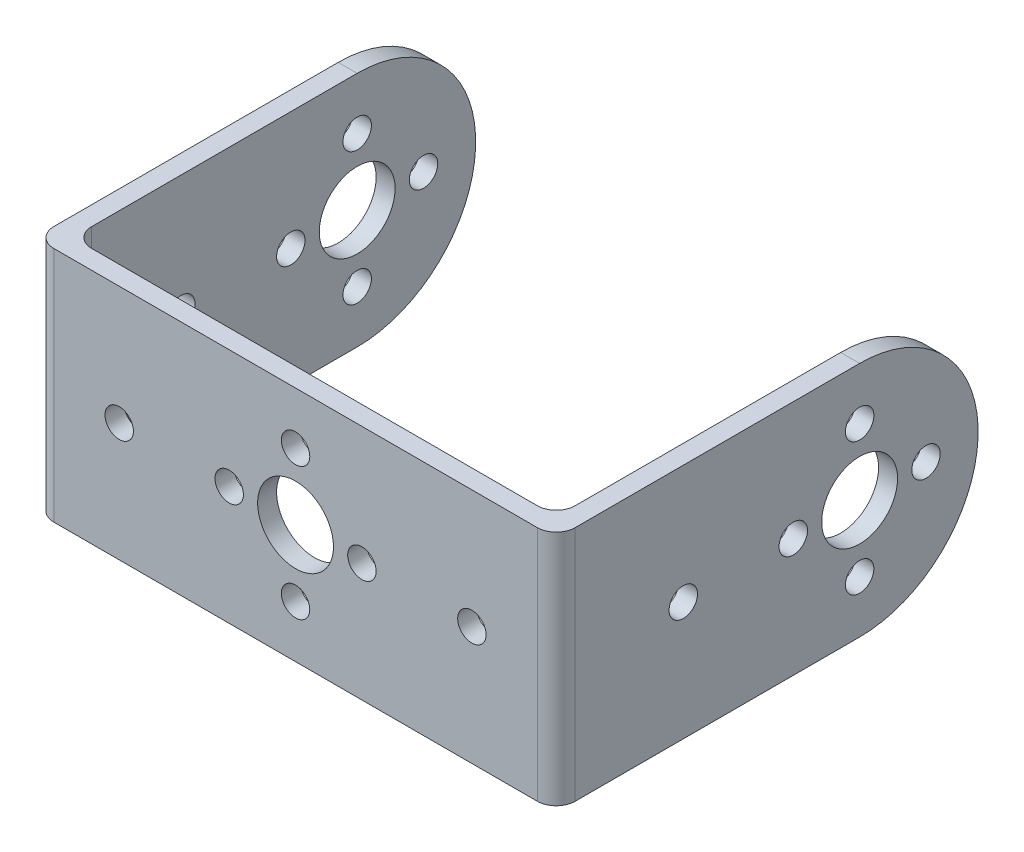
ISO-10303-21;
HEADER;
FILE_DESCRIPTION(('STEP AP214'),'2;1');
FILE_NAME('part.step','',(''),(''),'','','');
FILE_SCHEMA(('AUTOMOTIVE_DESIGN { 1 0 10303 214 1 1 1 1 }'));
ENDSEC;
DATA;
#1=APPLICATION_CONTEXT('core data for automotive mechanical design processes');
#2=APPLICATION_PROTOCOL_DEFINITION('international standard','automotive_design',2000,#1);
#3=PRODUCT_CONTEXT('',#1,'mechanical');
#4=PRODUCT('Part','Part','',(#3));
#5=PRODUCT_RELATED_PRODUCT_CATEGORY('part','',(#4));
#6=PRODUCT_DEFINITION_FORMATION('','',#4);
#7=PRODUCT_DEFINITION_CONTEXT('part definition',#1,'design');
#8=PRODUCT_DEFINITION('design','',#6,#7);
#9=PRODUCT_DEFINITION_SHAPE('','',#8);
#10=(LENGTH_UNIT() NAMED_UNIT(*) SI_UNIT(.MILLI.,.METRE.));
#11=(NAMED_UNIT(*) PLANE_ANGLE_UNIT() SI_UNIT($,.RADIAN.));
#12=(NAMED_UNIT(*) SI_UNIT($,.STERADIAN.) SOLID_ANGLE_UNIT());
#13=UNCERTAINTY_MEASURE_WITH_UNIT(LENGTH_MEASURE(1.E-05),#10,'distance_accuracy_value','');
#14=(GEOMETRIC_REPRESENTATION_CONTEXT(3) GLOBAL_UNCERTAINTY_ASSIGNED_CONTEXT((#13)) GLOBAL_UNIT_ASSIGNED_CONTEXT((#10,
#11,#12)) REPRESENTATION_CONTEXT('',''));
#15=CARTESIAN_POINT('',(0.,0.,0.));
#16=DIRECTION('',(0.,0.,1.));
#17=DIRECTION('',(1.,0.,0.));
#18=AXIS2_PLACEMENT_3D('',#15,#16,#17);
#19=CARTESIAN_POINT('',(-25.5,25.,-44.5));
#20=DIRECTION('',(1.,0.,0.));
#21=DIRECTION('',(0.,0.,-1.));
#22=AXIS2_PLACEMENT_3D('',#19,#20,#21);
#23=PLANE('',#22);
#24=CARTESIAN_POINT('',(-25.5,12.5,-32.));
#25=DIRECTION('',(1.,0.,0.));
#26=DIRECTION('',(0.,0.,-1.));
#27=AXIS2_PLACEMENT_3D('',#24,#25,#26);
#28=CIRCLE('',#27,4.00000000000001);
#29=CARTESIAN_POINT('',(-25.5,12.5,-36.));
#30=VERTEX_POINT('',#29);
#31=EDGE_CURVE('E324',#30,#30,#28,.F.);
#32=ORIENTED_EDGE('',*,*,#31,.T.);
#33=EDGE_LOOP('',(#32));
#34=FACE_BOUND('',#33,.T.);
#35=CARTESIAN_POINT('',(-25.5,19.5,-32.));
#36=DIRECTION('',(1.,0.,0.));
#37=DIRECTION('',(0.,0.,-1.));
#38=AXIS2_PLACEMENT_3D('',#35,#36,#37);
#39=CIRCLE('',#38,1.5);
#40=CARTESIAN_POINT('',(-25.5,19.5,-33.5));
#41=VERTEX_POINT('',#40);
#42=EDGE_CURVE('E321',#41,#41,#39,.F.);
#43=ORIENTED_EDGE('',*,*,#42,.T.);
#44=EDGE_LOOP('',(#43));
#45=FACE_BOUND('',#44,.T.);
#46=CARTESIAN_POINT('',(-25.5,12.5,-39.));
#47=DIRECTION('',(1.,0.,0.));
#48=DIRECTION('',(0.,0.,-1.));
#49=AXIS2_PLACEMENT_3D('',#46,#47,#48);
#50=CIRCLE('',#49,1.5);
#51=CARTESIAN_POINT('',(-25.5,12.5,-40.5));
#52=VERTEX_POINT('',#51);
#53=EDGE_CURVE('E318',#52,#52,#50,.F.);
#54=ORIENTED_EDGE('',*,*,#53,.T.);
#55=EDGE_LOOP('',(#54));
#56=FACE_BOUND('',#55,.T.);
#57=CARTESIAN_POINT('',(-25.5,5.5,-32.));
#58=DIRECTION('',(1.,0.,0.));
#59=DIRECTION('',(0.,0.,-1.));
#60=AXIS2_PLACEMENT_3D('',#57,#58,#59);
#61=CIRCLE('',#60,1.5);
#62=CARTESIAN_POINT('',(-25.5,5.5,-33.5));
#63=VERTEX_POINT('',#62);
#64=EDGE_CURVE('E301',#63,#63,#61,.F.);
#65=ORIENTED_EDGE('',*,*,#64,.T.);
#66=EDGE_LOOP('',(#65));
#67=FACE_BOUND('',#66,.T.);
#68=CARTESIAN_POINT('',(-25.5,12.5,-13.4));
#69=DIRECTION('',(1.,0.,0.));
#70=DIRECTION('',(0.,0.,-1.));
#71=AXIS2_PLACEMENT_3D('',#68,#69,#70);
#72=CIRCLE('',#71,1.5);
#73=CARTESIAN_POINT('',(-25.5,12.5,-14.9));
#74=VERTEX_POINT('',#73);
#75=EDGE_CURVE('E329',#74,#74,#72,.F.);
#76=ORIENTED_EDGE('',*,*,#75,.T.);
#77=EDGE_LOOP('',(#76));
#78=FACE_BOUND('',#77,.T.);
#79=CARTESIAN_POINT('',(-25.5,12.5,-25.));
#80=DIRECTION('',(1.,0.,0.));
#81=DIRECTION('',(0.,0.,-1.));
#82=AXIS2_PLACEMENT_3D('',#79,#80,#81);
#83=CIRCLE('',#82,1.5);
#84=CARTESIAN_POINT('',(-25.5,12.5,-26.5));
#85=VERTEX_POINT('',#84);
#86=EDGE_CURVE('E284',#85,#85,#83,.F.);
#87=ORIENTED_EDGE('',*,*,#86,.T.);
#88=EDGE_LOOP('',(#87));
#89=FACE_BOUND('',#88,.T.);
#90=DIRECTION('',(0.,0.,1.));
#91=VECTOR('',#90,1.);
#92=CARTESIAN_POINT('',(-25.5,25.,-44.5));
#93=LINE('',#92,#91);
#94=CARTESIAN_POINT('',(-25.5,25.,-32.));
#95=VERTEX_POINT('',#94);
#96=CARTESIAN_POINT('',(-25.5,25.,-4.));
#97=VERTEX_POINT('',#96);
#98=EDGE_CURVE('E275',#95,#97,#93,.T.);
#99=ORIENTED_EDGE('',*,*,#98,.T.);
#100=DIRECTION('',(0.,-1.,0.));
#101=VECTOR('',#100,1.);
#102=CARTESIAN_POINT('',(-25.5,25.,-4.));
#103=LINE('',#102,#101);
#104=CARTESIAN_POINT('',(-25.5,0.,-4.));
#105=VERTEX_POINT('',#104);
#106=EDGE_CURVE('E448',#97,#105,#103,.T.);
#107=ORIENTED_EDGE('',*,*,#106,.T.);
#108=DIRECTION('',(0.,0.,1.));
#109=VECTOR('',#108,1.);
#110=CARTESIAN_POINT('',(-25.5,0.,-44.5));
#111=LINE('',#110,#109);
#112=CARTESIAN_POINT('',(-25.5,0.,-32.));
#113=VERTEX_POINT('',#112);
#114=EDGE_CURVE('E332',#113,#105,#111,.T.);
#115=ORIENTED_EDGE('',*,*,#114,.F.);
#116=CARTESIAN_POINT('',(-25.5,12.5,-32.));
#117=DIRECTION('',(1.,0.,0.));
#118=DIRECTION('',(0.,0.,-1.));
#119=AXIS2_PLACEMENT_3D('',#116,#117,#118);
#120=CIRCLE('',#119,12.5);
#121=EDGE_CURVE('E327',#95,#113,#120,.F.);
#122=ORIENTED_EDGE('',*,*,#121,.F.);
#123=EDGE_LOOP('',(#99,#107,#115,#122));
#124=FACE_BOUND('',#123,.T.);
#125=ADVANCED_FACE('F180',(#34,#45,#56,#67,#78,#89,#124),#23,.T.);
#126=CARTESIAN_POINT('',(-27.5,25.,0.));
#127=DIRECTION('',(-1.,0.,0.));
#128=DIRECTION('',(0.,0.,1.));
#129=AXIS2_PLACEMENT_3D('',#126,#127,#128);
#130=PLANE('',#129);
#131=CARTESIAN_POINT('',(-27.5,12.5,-32.));
#132=DIRECTION('',(1.,0.,0.));
#133=DIRECTION('',(0.,0.,-1.));
#134=AXIS2_PLACEMENT_3D('',#131,#132,#133);
#135=CIRCLE('',#134,4.00000000000001);
#136=CARTESIAN_POINT('',(-27.5,12.5,-36.));
#137=VERTEX_POINT('',#136);
#138=EDGE_CURVE('E302',#137,#137,#135,.T.);
#139=ORIENTED_EDGE('',*,*,#138,.T.);
#140=EDGE_LOOP('',(#139));
#141=FACE_BOUND('',#140,.T.);
#142=CARTESIAN_POINT('',(-27.5,19.5,-32.));
#143=DIRECTION('',(1.,0.,0.));
#144=DIRECTION('',(0.,0.,-1.));
#145=AXIS2_PLACEMENT_3D('',#142,#143,#144);
#146=CIRCLE('',#145,1.5);
#147=CARTESIAN_POINT('',(-27.5,19.5,-33.5));
#148=VERTEX_POINT('',#147);
#149=EDGE_CURVE('E309',#148,#148,#146,.T.);
#150=ORIENTED_EDGE('',*,*,#149,.T.);
#151=EDGE_LOOP('',(#150));
#152=FACE_BOUND('',#151,.T.);
#153=CARTESIAN_POINT('',(-27.5,12.5,-39.));
#154=DIRECTION('',(1.,0.,0.));
#155=DIRECTION('',(0.,0.,-1.));
#156=AXIS2_PLACEMENT_3D('',#153,#154,#155);
#157=CIRCLE('',#156,1.5);
#158=CARTESIAN_POINT('',(-27.5,12.5,-40.5));
#159=VERTEX_POINT('',#158);
#160=EDGE_CURVE('E306',#159,#159,#157,.T.);
#161=ORIENTED_EDGE('',*,*,#160,.T.);
#162=EDGE_LOOP('',(#161));
#163=FACE_BOUND('',#162,.T.);
#164=CARTESIAN_POINT('',(-27.5,5.5,-32.));
#165=DIRECTION('',(1.,0.,0.));
#166=DIRECTION('',(0.,0.,-1.));
#167=AXIS2_PLACEMENT_3D('',#164,#165,#166);
#168=CIRCLE('',#167,1.5);
#169=CARTESIAN_POINT('',(-27.5,5.5,-33.5));
#170=VERTEX_POINT('',#169);
#171=EDGE_CURVE('E305',#170,#170,#168,.T.);
#172=ORIENTED_EDGE('',*,*,#171,.T.);
#173=EDGE_LOOP('',(#172));
#174=FACE_BOUND('',#173,.T.);
#175=CARTESIAN_POINT('',(-27.5,12.5,-13.4));
#176=DIRECTION('',(1.,0.,0.));
#177=DIRECTION('',(0.,0.,-1.));
#178=AXIS2_PLACEMENT_3D('',#175,#176,#177);
#179=CIRCLE('',#178,1.5);
#180=CARTESIAN_POINT('',(-27.5,12.5,-14.9));
#181=VERTEX_POINT('',#180);
#182=EDGE_CURVE('E299',#181,#181,#179,.T.);
#183=ORIENTED_EDGE('',*,*,#182,.T.);
#184=EDGE_LOOP('',(#183));
#185=FACE_BOUND('',#184,.T.);
#186=CARTESIAN_POINT('',(-27.5,12.5,-25.));
#187=DIRECTION('',(1.,0.,0.));
#188=DIRECTION('',(0.,0.,-1.));
#189=AXIS2_PLACEMENT_3D('',#186,#187,#188);
#190=CIRCLE('',#189,1.5);
#191=CARTESIAN_POINT('',(-27.5,12.5,-26.5));
#192=VERTEX_POINT('',#191);
#193=EDGE_CURVE('E288',#192,#192,#190,.T.);
#194=ORIENTED_EDGE('',*,*,#193,.T.);
#195=EDGE_LOOP('',(#194));
#196=FACE_BOUND('',#195,.T.);
#197=DIRECTION('',(0.,0.,-1.));
#198=VECTOR('',#197,1.);
#199=CARTESIAN_POINT('',(-27.5,0.,0.));
#200=LINE('',#199,#198);
#201=CARTESIAN_POINT('',(-27.5,0.,-2.));
#202=VERTEX_POINT('',#201);
#203=CARTESIAN_POINT('',(-27.5,0.,-32.));
#204=VERTEX_POINT('',#203);
#205=EDGE_CURVE('E333',#202,#204,#200,.T.);
#206=ORIENTED_EDGE('',*,*,#205,.F.);
#207=DIRECTION('',(0.,-1.,0.));
#208=VECTOR('',#207,1.);
#209=CARTESIAN_POINT('',(-27.5,25.,-2.));
#210=LINE('',#209,#208);
#211=CARTESIAN_POINT('',(-27.5,25.,-2.));
#212=VERTEX_POINT('',#211);
#213=EDGE_CURVE('E201',#202,#212,#210,.F.);
#214=ORIENTED_EDGE('',*,*,#213,.T.);
#215=DIRECTION('',(0.,0.,-1.));
#216=VECTOR('',#215,1.);
#217=CARTESIAN_POINT('',(-27.5,25.,0.));
#218=LINE('',#217,#216);
#219=CARTESIAN_POINT('',(-27.5,25.,-32.));
#220=VERTEX_POINT('',#219);
#221=EDGE_CURVE('E268',#212,#220,#218,.T.);
#222=ORIENTED_EDGE('',*,*,#221,.T.);
#223=CARTESIAN_POINT('',(-27.5,12.5,-32.));
#224=DIRECTION('',(1.,0.,0.));
#225=DIRECTION('',(0.,0.,-1.));
#226=AXIS2_PLACEMENT_3D('',#223,#224,#225);
#227=CIRCLE('',#226,12.5);
#228=EDGE_CURVE('E271',#204,#220,#227,.T.);
#229=ORIENTED_EDGE('',*,*,#228,.F.);
#230=EDGE_LOOP('',(#206,#214,#222,#229));
#231=FACE_BOUND('',#230,.T.);
#232=ADVANCED_FACE('F270',(#141,#152,#163,#174,#185,#196,#231),#130,.T.);
#233=CARTESIAN_POINT('',(27.5,25.,0.));
#234=DIRECTION('',(-1.,0.,0.));
#235=DIRECTION('',(0.,0.,1.));
#236=AXIS2_PLACEMENT_3D('',#233,#234,#235);
#237=PLANE('',#236);
#238=CARTESIAN_POINT('',(27.5,12.5,-32.));
#239=DIRECTION('',(1.,0.,0.));
#240=DIRECTION('',(0.,0.,-1.));
#241=AXIS2_PLACEMENT_3D('',#238,#239,#240);
#242=CIRCLE('',#241,4.00000000000001);
#243=CARTESIAN_POINT('',(27.5,12.5,-36.));
#244=VERTEX_POINT('',#243);
#245=EDGE_CURVE('E345',#244,#244,#242,.T.);
#246=ORIENTED_EDGE('',*,*,#245,.F.);
#247=EDGE_LOOP('',(#246));
#248=FACE_BOUND('',#247,.T.);
#249=CARTESIAN_POINT('',(27.5,19.5,-32.));
#250=DIRECTION('',(1.,0.,0.));
#251=DIRECTION('',(0.,0.,-1.));
#252=AXIS2_PLACEMENT_3D('',#249,#250,#251);
#253=CIRCLE('',#252,1.5);
#254=CARTESIAN_POINT('',(27.5,19.5,-33.5));
#255=VERTEX_POINT('',#254);
#256=EDGE_CURVE('E353',#255,#255,#253,.T.);
#257=ORIENTED_EDGE('',*,*,#256,.F.);
#258=EDGE_LOOP('',(#257));
#259=FACE_BOUND('',#258,.T.);
#260=CARTESIAN_POINT('',(27.5,12.5,-39.));
#261=DIRECTION('',(1.,0.,0.));
#262=DIRECTION('',(0.,0.,-1.));
#263=AXIS2_PLACEMENT_3D('',#260,#261,#262);
#264=CIRCLE('',#263,1.5);
#265=CARTESIAN_POINT('',(27.5,12.5,-40.5));
#266=VERTEX_POINT('',#265);
#267=EDGE_CURVE('E350',#266,#266,#264,.T.);
#268=ORIENTED_EDGE('',*,*,#267,.F.);
#269=EDGE_LOOP('',(#268));
#270=FACE_BOUND('',#269,.T.);
#271=CARTESIAN_POINT('',(27.5,5.5,-32.));
#272=DIRECTION('',(1.,0.,0.));
#273=DIRECTION('',(0.,0.,-1.));
#274=AXIS2_PLACEMENT_3D('',#271,#272,#273);
#275=CIRCLE('',#274,1.5);
#276=CARTESIAN_POINT('',(27.5,5.5,-33.5));
#277=VERTEX_POINT('',#276);
#278=EDGE_CURVE('E349',#277,#277,#275,.T.);
#279=ORIENTED_EDGE('',*,*,#278,.F.);
#280=EDGE_LOOP('',(#279));
#281=FACE_BOUND('',#280,.T.);
#282=CARTESIAN_POINT('',(27.5,12.5,-13.4));
#283=DIRECTION('',(1.,0.,0.));
#284=DIRECTION('',(0.,0.,-1.));
#285=AXIS2_PLACEMENT_3D('',#282,#283,#284);
#286=CIRCLE('',#285,1.5);
#287=CARTESIAN_POINT('',(27.5,12.5,-14.9));
#288=VERTEX_POINT('',#287);
#289=EDGE_CURVE('E341',#288,#288,#286,.T.);
#290=ORIENTED_EDGE('',*,*,#289,.F.);
#291=EDGE_LOOP('',(#290));
#292=FACE_BOUND('',#291,.T.);
#293=CARTESIAN_POINT('',(27.5,12.5,-25.));
#294=DIRECTION('',(1.,0.,0.));
#295=DIRECTION('',(0.,0.,-1.));
#296=AXIS2_PLACEMENT_3D('',#293,#294,#295);
#297=CIRCLE('',#296,1.5);
#298=CARTESIAN_POINT('',(27.5,12.5,-26.5));
#299=VERTEX_POINT('',#298);
#300=EDGE_CURVE('E274',#299,#299,#297,.T.);
#301=ORIENTED_EDGE('',*,*,#300,.F.);
#302=EDGE_LOOP('',(#301));
#303=FACE_BOUND('',#302,.T.);
#304=DIRECTION('',(0.,0.,-1.));
#305=VECTOR('',#304,1.);
#306=CARTESIAN_POINT('',(27.5,25.,0.));
#307=LINE('',#306,#305);
#308=CARTESIAN_POINT('',(27.5,25.,-2.));
#309=VERTEX_POINT('',#308);
#310=CARTESIAN_POINT('',(27.5,25.,-32.));
#311=VERTEX_POINT('',#310);
#312=EDGE_CURVE('E364',#309,#311,#307,.T.);
#313=ORIENTED_EDGE('',*,*,#312,.F.);
#314=DIRECTION('',(0.,-1.,0.));
#315=VECTOR('',#314,1.);
#316=CARTESIAN_POINT('',(27.5,25.,-2.));
#317=LINE('',#316,#315);
#318=CARTESIAN_POINT('',(27.5,0.,-2.));
#319=VERTEX_POINT('',#318);
#320=EDGE_CURVE('E432',#309,#319,#317,.T.);
#321=ORIENTED_EDGE('',*,*,#320,.T.);
#322=DIRECTION('',(0.,0.,-1.));
#323=VECTOR('',#322,1.);
#324=CARTESIAN_POINT('',(27.5,0.,0.));
#325=LINE('',#324,#323);
#326=CARTESIAN_POINT('',(27.5,0.,-32.));
#327=VERTEX_POINT('',#326);
#328=EDGE_CURVE('E376',#319,#327,#325,.T.);
#329=ORIENTED_EDGE('',*,*,#328,.T.);
#330=CARTESIAN_POINT('',(27.5,12.5,-32.));
#331=DIRECTION('',(1.,0.,0.));
#332=DIRECTION('',(0.,0.,-1.));
#333=AXIS2_PLACEMENT_3D('',#330,#331,#332);
#334=CIRCLE('',#333,12.5);
#335=EDGE_CURVE('E346',#327,#311,#334,.T.);
#336=ORIENTED_EDGE('',*,*,#335,.T.);
#337=EDGE_LOOP('',(#313,#321,#329,#336));
#338=FACE_BOUND('',#337,.T.);
#339=ADVANCED_FACE('F483',(#248,#259,#270,#281,#292,#303,#338),#237,.F.);
#340=CARTESIAN_POINT('',(25.5,25.,-44.5));
#341=DIRECTION('',(1.,0.,0.));
#342=DIRECTION('',(0.,0.,-1.));
#343=AXIS2_PLACEMENT_3D('',#340,#341,#342);
#344=PLANE('',#343);
#345=CARTESIAN_POINT('',(25.5,12.5,-32.));
#346=DIRECTION('',(1.,0.,0.));
#347=DIRECTION('',(0.,0.,-1.));
#348=AXIS2_PLACEMENT_3D('',#345,#346,#347);
#349=CIRCLE('',#348,4.00000000000001);
#350=CARTESIAN_POINT('',(25.5,12.5,-36.));
#351=VERTEX_POINT('',#350);
#352=EDGE_CURVE('E395',#351,#351,#349,.T.);
#353=ORIENTED_EDGE('',*,*,#352,.T.);
#354=EDGE_LOOP('',(#353));
#355=FACE_BOUND('',#354,.T.);
#356=CARTESIAN_POINT('',(25.5,19.5,-32.));
#357=DIRECTION('',(1.,0.,0.));
#358=DIRECTION('',(0.,0.,-1.));
#359=AXIS2_PLACEMENT_3D('',#356,#357,#358);
#360=CIRCLE('',#359,1.5);
#361=CARTESIAN_POINT('',(25.5,19.5,-33.5));
#362=VERTEX_POINT('',#361);
#363=EDGE_CURVE('E392',#362,#362,#360,.T.);
#364=ORIENTED_EDGE('',*,*,#363,.T.);
#365=EDGE_LOOP('',(#364));
#366=FACE_BOUND('',#365,.T.);
#367=CARTESIAN_POINT('',(25.5,12.5,-39.));
#368=DIRECTION('',(1.,0.,0.));
#369=DIRECTION('',(0.,0.,-1.));
#370=AXIS2_PLACEMENT_3D('',#367,#368,#369);
#371=CIRCLE('',#370,1.5);
#372=CARTESIAN_POINT('',(25.5,12.5,-40.5));
#373=VERTEX_POINT('',#372);
#374=EDGE_CURVE('E389',#373,#373,#371,.T.);
#375=ORIENTED_EDGE('',*,*,#374,.T.);
#376=EDGE_LOOP('',(#375));
#377=FACE_BOUND('',#376,.T.);
#378=CARTESIAN_POINT('',(25.5,5.5,-32.));
#379=DIRECTION('',(1.,0.,0.));
#380=DIRECTION('',(0.,0.,-1.));
#381=AXIS2_PLACEMENT_3D('',#378,#379,#380);
#382=CIRCLE('',#381,1.5);
#383=CARTESIAN_POINT('',(25.5,5.5,-33.5));
#384=VERTEX_POINT('',#383);
#385=EDGE_CURVE('E361',#384,#384,#382,.T.);
#386=ORIENTED_EDGE('',*,*,#385,.T.);
#387=EDGE_LOOP('',(#386));
#388=FACE_BOUND('',#387,.T.);
#389=CARTESIAN_POINT('',(25.5,12.5,-13.4));
#390=DIRECTION('',(1.,0.,0.));
#391=DIRECTION('',(0.,0.,-1.));
#392=AXIS2_PLACEMENT_3D('',#389,#390,#391);
#393=CIRCLE('',#392,1.5);
#394=CARTESIAN_POINT('',(25.5,12.5,-14.9));
#395=VERTEX_POINT('',#394);
#396=EDGE_CURVE('E377',#395,#395,#393,.T.);
#397=ORIENTED_EDGE('',*,*,#396,.T.);
#398=EDGE_LOOP('',(#397));
#399=FACE_BOUND('',#398,.T.);
#400=CARTESIAN_POINT('',(25.5,12.5,-25.));
#401=DIRECTION('',(1.,0.,0.));
#402=DIRECTION('',(0.,0.,-1.));
#403=AXIS2_PLACEMENT_3D('',#400,#401,#402);
#404=CIRCLE('',#403,1.5);
#405=CARTESIAN_POINT('',(25.5,12.5,-26.5));
#406=VERTEX_POINT('',#405);
#407=EDGE_CURVE('E340',#406,#406,#404,.T.);
#408=ORIENTED_EDGE('',*,*,#407,.T.);
#409=EDGE_LOOP('',(#408));
#410=FACE_BOUND('',#409,.T.);
#411=DIRECTION('',(0.,0.,1.));
#412=VECTOR('',#411,1.);
#413=CARTESIAN_POINT('',(25.5,0.,-44.5));
#414=LINE('',#413,#412);
#415=CARTESIAN_POINT('',(25.5,0.,-32.));
#416=VERTEX_POINT('',#415);
#417=CARTESIAN_POINT('',(25.5,0.,-4.));
#418=VERTEX_POINT('',#417);
#419=EDGE_CURVE('E379',#416,#418,#414,.T.);
#420=ORIENTED_EDGE('',*,*,#419,.T.);
#421=DIRECTION('',(0.,-1.,0.));
#422=VECTOR('',#421,1.);
#423=CARTESIAN_POINT('',(25.5,25.,-4.));
#424=LINE('',#423,#422);
#425=CARTESIAN_POINT('',(25.5,25.,-4.));
#426=VERTEX_POINT('',#425);
#427=EDGE_CURVE('E430',#418,#426,#424,.F.);
#428=ORIENTED_EDGE('',*,*,#427,.T.);
#429=DIRECTION('',(0.,0.,1.));
#430=VECTOR('',#429,1.);
#431=CARTESIAN_POINT('',(25.5,25.,-44.5));
#432=LINE('',#431,#430);
#433=CARTESIAN_POINT('',(25.5,25.,-32.));
#434=VERTEX_POINT('',#433);
#435=EDGE_CURVE('E367',#434,#426,#432,.T.);
#436=ORIENTED_EDGE('',*,*,#435,.F.);
#437=CARTESIAN_POINT('',(25.5,12.5,-32.));
#438=DIRECTION('',(1.,0.,0.));
#439=DIRECTION('',(0.,0.,-1.));
#440=AXIS2_PLACEMENT_3D('',#437,#438,#439);
#441=CIRCLE('',#440,12.5);
#442=EDGE_CURVE('E344',#416,#434,#441,.T.);
#443=ORIENTED_EDGE('',*,*,#442,.F.);
#444=EDGE_LOOP('',(#420,#428,#436,#443));
#445=FACE_BOUND('',#444,.T.);
#446=ADVANCED_FACE('F491',(#355,#366,#377,#388,#399,#410,#445),#344,.F.);
#447=CARTESIAN_POINT('',(0.,25.,0.));
#448=DIRECTION('',(0.,0.,-1.));
#449=DIRECTION('',(-1.,0.,0.));
#450=AXIS2_PLACEMENT_3D('',#447,#448,#449);
#451=PLANE('',#450);
#452=CARTESIAN_POINT('',(0.,19.5,0.));
#453=DIRECTION('',(0.,0.,1.));
#454=DIRECTION('',(1.,0.,0.));
#455=AXIS2_PLACEMENT_3D('',#452,#453,#454);
#456=CIRCLE('',#455,1.5);
#457=CARTESIAN_POINT('',(1.5,19.5,0.));
#458=VERTEX_POINT('',#457);
#459=EDGE_CURVE('E409',#458,#458,#456,.T.);
#460=ORIENTED_EDGE('',*,*,#459,.F.);
#461=EDGE_LOOP('',(#460));
#462=FACE_BOUND('',#461,.T.);
#463=CARTESIAN_POINT('',(18.6,12.5,0.));
#464=DIRECTION('',(0.,0.,1.));
#465=DIRECTION('',(1.,0.,0.));
#466=AXIS2_PLACEMENT_3D('',#463,#464,#465);
#467=CIRCLE('',#466,1.5);
#468=CARTESIAN_POINT('',(20.1,12.5,0.));
#469=VERTEX_POINT('',#468);
#470=EDGE_CURVE('E568',#469,#469,#467,.T.);
#471=ORIENTED_EDGE('',*,*,#470,.F.);
#472=EDGE_LOOP('',(#471));
#473=FACE_BOUND('',#472,.T.);
#474=CARTESIAN_POINT('',(0.,12.5,0.));
#475=DIRECTION('',(0.,0.,1.));
#476=DIRECTION('',(1.,0.,0.));
#477=AXIS2_PLACEMENT_3D('',#474,#475,#476);
#478=CIRCLE('',#477,4.);
#479=CARTESIAN_POINT('',(4.,12.5,0.));
#480=VERTEX_POINT('',#479);
#481=EDGE_CURVE('E572',#480,#480,#478,.T.);
#482=ORIENTED_EDGE('',*,*,#481,.F.);
#483=EDGE_LOOP('',(#482));
#484=FACE_BOUND('',#483,.T.);
#485=CARTESIAN_POINT('',(-18.6,12.5,0.));
#486=DIRECTION('',(0.,0.,1.));
#487=DIRECTION('',(1.,0.,0.));
#488=AXIS2_PLACEMENT_3D('',#485,#486,#487);
#489=CIRCLE('',#488,1.5);
#490=CARTESIAN_POINT('',(-17.1,12.5,0.));
#491=VERTEX_POINT('',#490);
#492=EDGE_CURVE('E296',#491,#491,#489,.T.);
#493=ORIENTED_EDGE('',*,*,#492,.F.);
#494=EDGE_LOOP('',(#493));
#495=FACE_BOUND('',#494,.T.);
#496=CARTESIAN_POINT('',(-7.,12.5,0.));
#497=DIRECTION('',(0.,0.,1.));
#498=DIRECTION('',(1.,0.,0.));
#499=AXIS2_PLACEMENT_3D('',#496,#497,#498);
#500=CIRCLE('',#499,1.5);
#501=CARTESIAN_POINT('',(-5.5,12.5,0.));
#502=VERTEX_POINT('',#501);
#503=EDGE_CURVE('E579',#502,#502,#500,.T.);
#504=ORIENTED_EDGE('',*,*,#503,.F.);
#505=EDGE_LOOP('',(#504));
#506=FACE_BOUND('',#505,.T.);
#507=CARTESIAN_POINT('',(0.,5.5,0.));
#508=DIRECTION('',(0.,0.,1.));
#509=DIRECTION('',(1.,0.,0.));
#510=AXIS2_PLACEMENT_3D('',#507,#508,#509);
#511=CIRCLE('',#510,1.5);
#512=CARTESIAN_POINT('',(1.5,5.5,0.));
#513=VERTEX_POINT('',#512);
#514=EDGE_CURVE('E583',#513,#513,#511,.T.);
#515=ORIENTED_EDGE('',*,*,#514,.F.);
#516=EDGE_LOOP('',(#515));
#517=FACE_BOUND('',#516,.T.);
#518=CARTESIAN_POINT('',(7.,12.5,0.));
#519=DIRECTION('',(0.,0.,1.));
#520=DIRECTION('',(1.,0.,0.));
#521=AXIS2_PLACEMENT_3D('',#518,#519,#520);
#522=CIRCLE('',#521,1.5);
#523=CARTESIAN_POINT('',(8.5,12.5,0.));
#524=VERTEX_POINT('',#523);
#525=EDGE_CURVE('E586',#524,#524,#522,.T.);
#526=ORIENTED_EDGE('',*,*,#525,.F.);
#527=EDGE_LOOP('',(#526));
#528=FACE_BOUND('',#527,.T.);
#529=DIRECTION('',(1.,0.,0.));
#530=VECTOR('',#529,1.);
#531=CARTESIAN_POINT('',(0.,0.,0.));
#532=LINE('',#531,#530);
#533=CARTESIAN_POINT('',(-25.5,0.,0.));
#534=VERTEX_POINT('',#533);
#535=CARTESIAN_POINT('',(25.5,0.,0.));
#536=VERTEX_POINT('',#535);
#537=EDGE_CURVE('E373',#534,#536,#532,.T.);
#538=ORIENTED_EDGE('',*,*,#537,.T.);
#539=DIRECTION('',(0.,-1.,0.));
#540=VECTOR('',#539,1.);
#541=CARTESIAN_POINT('',(25.5,25.,0.));
#542=LINE('',#541,#540);
#543=CARTESIAN_POINT('',(25.5,25.,0.));
#544=VERTEX_POINT('',#543);
#545=EDGE_CURVE('E442',#536,#544,#542,.F.);
#546=ORIENTED_EDGE('',*,*,#545,.T.);
#547=DIRECTION('',(1.,0.,0.));
#548=VECTOR('',#547,1.);
#549=CARTESIAN_POINT('',(0.,25.,0.));
#550=LINE('',#549,#548);
#551=CARTESIAN_POINT('',(-25.5,25.,0.));
#552=VERTEX_POINT('',#551);
#553=EDGE_CURVE('E362',#552,#544,#550,.T.);
#554=ORIENTED_EDGE('',*,*,#553,.F.);
#555=DIRECTION('',(0.,-1.,0.));
#556=VECTOR('',#555,1.);
#557=CARTESIAN_POINT('',(-25.5,0.,0.));
#558=LINE('',#557,#556);
#559=EDGE_CURVE('E439',#552,#534,#558,.T.);
#560=ORIENTED_EDGE('',*,*,#559,.T.);
#561=EDGE_LOOP('',(#538,#546,#554,#560));
#562=FACE_BOUND('',#561,.T.);
#563=ADVANCED_FACE('F475',(#462,#473,#484,#495,#506,#517,#528,#562),#451,.F.);
#564=CARTESIAN_POINT('',(25.5,25.,-2.));
#565=DIRECTION('',(0.,0.,1.));
#566=DIRECTION('',(1.,0.,0.));
#567=AXIS2_PLACEMENT_3D('',#564,#565,#566);
#568=PLANE('',#567);
#569=CARTESIAN_POINT('',(0.,19.5,-2.));
#570=DIRECTION('',(0.,0.,1.));
#571=DIRECTION('',(1.,0.,0.));
#572=AXIS2_PLACEMENT_3D('',#569,#570,#571);
#573=CIRCLE('',#572,1.5);
#574=CARTESIAN_POINT('',(1.5,19.5,-2.));
#575=VERTEX_POINT('',#574);
#576=EDGE_CURVE('E293',#575,#575,#573,.T.);
#577=ORIENTED_EDGE('',*,*,#576,.T.);
#578=EDGE_LOOP('',(#577));
#579=FACE_BOUND('',#578,.T.);
#580=CARTESIAN_POINT('',(18.6,12.5,-2.));
#581=DIRECTION('',(0.,0.,1.));
#582=DIRECTION('',(1.,0.,0.));
#583=AXIS2_PLACEMENT_3D('',#580,#581,#582);
#584=CIRCLE('',#583,1.5);
#585=CARTESIAN_POINT('',(20.1,12.5,-2.));
#586=VERTEX_POINT('',#585);
#587=EDGE_CURVE('E421',#586,#586,#584,.T.);
#588=ORIENTED_EDGE('',*,*,#587,.T.);
#589=EDGE_LOOP('',(#588));
#590=FACE_BOUND('',#589,.T.);
#591=CARTESIAN_POINT('',(0.,12.5,-2.));
#592=DIRECTION('',(0.,0.,1.));
#593=DIRECTION('',(1.,0.,0.));
#594=AXIS2_PLACEMENT_3D('',#591,#592,#593);
#595=CIRCLE('',#594,4.);
#596=CARTESIAN_POINT('',(4.,12.5,-2.));
#597=VERTEX_POINT('',#596);
#598=EDGE_CURVE('E418',#597,#597,#595,.T.);
#599=ORIENTED_EDGE('',*,*,#598,.T.);
#600=EDGE_LOOP('',(#599));
#601=FACE_BOUND('',#600,.T.);
#602=CARTESIAN_POINT('',(-18.6,12.5,-1.99999999999999));
#603=DIRECTION('',(0.,0.,1.));
#604=DIRECTION('',(1.,0.,0.));
#605=AXIS2_PLACEMENT_3D('',#602,#603,#604);
#606=CIRCLE('',#605,1.5);
#607=CARTESIAN_POINT('',(-17.1,12.5,-1.99999999999999));
#608=VERTEX_POINT('',#607);
#609=EDGE_CURVE('E415',#608,#608,#606,.T.);
#610=ORIENTED_EDGE('',*,*,#609,.T.);
#611=EDGE_LOOP('',(#610));
#612=FACE_BOUND('',#611,.T.);
#613=CARTESIAN_POINT('',(-7.,12.5,-2.));
#614=DIRECTION('',(0.,0.,1.));
#615=DIRECTION('',(1.,0.,0.));
#616=AXIS2_PLACEMENT_3D('',#613,#614,#615);
#617=CIRCLE('',#616,1.5);
#618=CARTESIAN_POINT('',(-5.5,12.5,-2.));
#619=VERTEX_POINT('',#618);
#620=EDGE_CURVE('E412',#619,#619,#617,.T.);
#621=ORIENTED_EDGE('',*,*,#620,.T.);
#622=EDGE_LOOP('',(#621));
#623=FACE_BOUND('',#622,.T.);
#624=CARTESIAN_POINT('',(0.,5.5,-2.));
#625=DIRECTION('',(0.,0.,1.));
#626=DIRECTION('',(1.,0.,0.));
#627=AXIS2_PLACEMENT_3D('',#624,#625,#626);
#628=CIRCLE('',#627,1.5);
#629=CARTESIAN_POINT('',(1.5,5.5,-2.));
#630=VERTEX_POINT('',#629);
#631=EDGE_CURVE('E408',#630,#630,#628,.T.);
#632=ORIENTED_EDGE('',*,*,#631,.T.);
#633=EDGE_LOOP('',(#632));
#634=FACE_BOUND('',#633,.T.);
#635=CARTESIAN_POINT('',(7.,12.5,-2.));
#636=DIRECTION('',(0.,0.,1.));
#637=DIRECTION('',(1.,0.,0.));
#638=AXIS2_PLACEMENT_3D('',#635,#636,#637);
#639=CIRCLE('',#638,1.5);
#640=CARTESIAN_POINT('',(8.5,12.5,-2.));
#641=VERTEX_POINT('',#640);
#642=EDGE_CURVE('E405',#641,#641,#639,.T.);
#643=ORIENTED_EDGE('',*,*,#642,.T.);
#644=EDGE_LOOP('',(#643));
#645=FACE_BOUND('',#644,.T.);
#646=DIRECTION('',(-1.,0.,0.));
#647=VECTOR('',#646,1.);
#648=CARTESIAN_POINT('',(25.5,25.,-2.));
#649=LINE('',#648,#647);
#650=CARTESIAN_POINT('',(23.5,25.,-2.));
#651=VERTEX_POINT('',#650);
#652=CARTESIAN_POINT('',(-23.5,25.,-2.));
#653=VERTEX_POINT('',#652);
#654=EDGE_CURVE('E370',#651,#653,#649,.T.);
#655=ORIENTED_EDGE('',*,*,#654,.F.);
#656=DIRECTION('',(0.,-1.,0.));
#657=VECTOR('',#656,1.);
#658=CARTESIAN_POINT('',(23.5,0.,-2.));
#659=LINE('',#658,#657);
#660=CARTESIAN_POINT('',(23.5,0.,-2.));
#661=VERTEX_POINT('',#660);
#662=EDGE_CURVE('E427',#651,#661,#659,.T.);
#663=ORIENTED_EDGE('',*,*,#662,.T.);
#664=DIRECTION('',(-1.,0.,0.));
#665=VECTOR('',#664,1.);
#666=CARTESIAN_POINT('',(25.5,0.,-2.));
#667=LINE('',#666,#665);
#668=CARTESIAN_POINT('',(-23.5,0.,-2.));
#669=VERTEX_POINT('',#668);
#670=EDGE_CURVE('E365',#661,#669,#667,.T.);
#671=ORIENTED_EDGE('',*,*,#670,.T.);
#672=DIRECTION('',(0.,-1.,0.));
#673=VECTOR('',#672,1.);
#674=CARTESIAN_POINT('',(-23.5,25.,-2.));
#675=LINE('',#674,#673);
#676=EDGE_CURVE('E402',#669,#653,#675,.F.);
#677=ORIENTED_EDGE('',*,*,#676,.T.);
#678=EDGE_LOOP('',(#655,#663,#671,#677));
#679=FACE_BOUND('',#678,.T.);
#680=ADVANCED_FACE('F465',(#579,#590,#601,#612,#623,#634,#645,#679),#568,.F.);
#681=CARTESIAN_POINT('',(0.,25.,0.));
#682=DIRECTION('',(0.,1.,0.));
#683=DIRECTION('',(0.,0.,1.));
#684=AXIS2_PLACEMENT_3D('',#681,#682,#683);
#685=PLANE('',#684);
#686=ORIENTED_EDGE('',*,*,#553,.T.);
#687=CARTESIAN_POINT('',(25.5,25.,-2.));
#688=DIRECTION('',(0.,1.,0.));
#689=DIRECTION('',(0.,0.,1.));
#690=AXIS2_PLACEMENT_3D('',#687,#688,#689);
#691=CIRCLE('',#690,2.);
#692=EDGE_CURVE('E446',#544,#309,#691,.T.);
#693=ORIENTED_EDGE('',*,*,#692,.T.);
#694=ORIENTED_EDGE('',*,*,#312,.T.);
#695=DIRECTION('',(1.,0.,0.));
#696=VECTOR('',#695,1.);
#697=CARTESIAN_POINT('',(2.5,25.,-32.));
#698=LINE('',#697,#696);
#699=EDGE_CURVE('E372',#434,#311,#698,.T.);
#700=ORIENTED_EDGE('',*,*,#699,.F.);
#701=ORIENTED_EDGE('',*,*,#435,.T.);
#702=CARTESIAN_POINT('',(23.5,25.,-4.));
#703=DIRECTION('',(0.,1.,0.));
#704=DIRECTION('',(0.,0.,1.));
#705=AXIS2_PLACEMENT_3D('',#702,#703,#704);
#706=CIRCLE('',#705,2.);
#707=EDGE_CURVE('E454',#426,#651,#706,.F.);
#708=ORIENTED_EDGE('',*,*,#707,.T.);
#709=ORIENTED_EDGE('',*,*,#654,.T.);
#710=CARTESIAN_POINT('',(-23.5,25.,-4.));
#711=DIRECTION('',(0.,1.,0.));
#712=DIRECTION('',(0.,0.,1.));
#713=AXIS2_PLACEMENT_3D('',#710,#711,#712);
#714=CIRCLE('',#713,2.);
#715=EDGE_CURVE('E12',#653,#97,#714,.F.);
#716=ORIENTED_EDGE('',*,*,#715,.T.);
#717=ORIENTED_EDGE('',*,*,#98,.F.);
#718=DIRECTION('',(-1.,0.,0.));
#719=VECTOR('',#718,1.);
#720=CARTESIAN_POINT('',(-2.5,25.,-32.));
#721=LINE('',#720,#719);
#722=EDGE_CURVE('E281',#95,#220,#721,.T.);
#723=ORIENTED_EDGE('',*,*,#722,.T.);
#724=ORIENTED_EDGE('',*,*,#221,.F.);
#725=CARTESIAN_POINT('',(-25.5,25.,-2.));
#726=DIRECTION('',(0.,1.,0.));
#727=DIRECTION('',(0.,0.,1.));
#728=AXIS2_PLACEMENT_3D('',#725,#726,#727);
#729=CIRCLE('',#728,2.);
#730=EDGE_CURVE('E444',#212,#552,#729,.T.);
#731=ORIENTED_EDGE('',*,*,#730,.T.);
#732=EDGE_LOOP('',(#686,#693,#694,#700,#701,#708,#709,#716,#717,#723,#724,#731));
#733=FACE_BOUND('',#732,.T.);
#734=ADVANCED_FACE('F287',(#733),#685,.T.);
#735=CARTESIAN_POINT('',(0.,0.,0.));
#736=DIRECTION('',(0.,1.,0.));
#737=DIRECTION('',(0.,0.,1.));
#738=AXIS2_PLACEMENT_3D('',#735,#736,#737);
#739=PLANE('',#738);
#740=ORIENTED_EDGE('',*,*,#328,.F.);
#741=CARTESIAN_POINT('',(25.5,0.,-2.));
#742=DIRECTION('',(0.,1.,0.));
#743=DIRECTION('',(0.,0.,1.));
#744=AXIS2_PLACEMENT_3D('',#741,#742,#743);
#745=CIRCLE('',#744,2.);
#746=EDGE_CURVE('E437',#319,#536,#745,.F.);
#747=ORIENTED_EDGE('',*,*,#746,.T.);
#748=ORIENTED_EDGE('',*,*,#537,.F.);
#749=CARTESIAN_POINT('',(-25.5,0.,-2.));
#750=DIRECTION('',(0.,1.,0.));
#751=DIRECTION('',(0.,0.,1.));
#752=AXIS2_PLACEMENT_3D('',#749,#750,#751);
#753=CIRCLE('',#752,2.);
#754=EDGE_CURVE('E435',#534,#202,#753,.F.);
#755=ORIENTED_EDGE('',*,*,#754,.T.);
#756=ORIENTED_EDGE('',*,*,#205,.T.);
#757=DIRECTION('',(-1.,0.,0.));
#758=VECTOR('',#757,1.);
#759=CARTESIAN_POINT('',(-2.5,0.,-32.));
#760=LINE('',#759,#758);
#761=EDGE_CURVE('E283',#113,#204,#760,.T.);
#762=ORIENTED_EDGE('',*,*,#761,.F.);
#763=ORIENTED_EDGE('',*,*,#114,.T.);
#764=CARTESIAN_POINT('',(-23.5,0.,-4.));
#765=DIRECTION('',(0.,1.,0.));
#766=DIRECTION('',(0.,0.,1.));
#767=AXIS2_PLACEMENT_3D('',#764,#765,#766);
#768=CIRCLE('',#767,2.);
#769=EDGE_CURVE('E188',#105,#669,#768,.T.);
#770=ORIENTED_EDGE('',*,*,#769,.T.);
#771=ORIENTED_EDGE('',*,*,#670,.F.);
#772=CARTESIAN_POINT('',(23.5,0.,-4.));
#773=DIRECTION('',(0.,1.,0.));
#774=DIRECTION('',(0.,0.,1.));
#775=AXIS2_PLACEMENT_3D('',#772,#773,#774);
#776=CIRCLE('',#775,2.);
#777=EDGE_CURVE('E452',#661,#418,#776,.T.);
#778=ORIENTED_EDGE('',*,*,#777,.T.);
#779=ORIENTED_EDGE('',*,*,#419,.F.);
#780=DIRECTION('',(1.,0.,0.));
#781=VECTOR('',#780,1.);
#782=CARTESIAN_POINT('',(2.5,0.,-32.));
#783=LINE('',#782,#781);
#784=EDGE_CURVE('E386',#416,#327,#783,.T.);
#785=ORIENTED_EDGE('',*,*,#784,.T.);
#786=EDGE_LOOP('',(#740,#747,#748,#755,#756,#762,#763,#770,#771,#778,#779,#785));
#787=FACE_BOUND('',#786,.T.);
#788=ADVANCED_FACE('F458',(#787),#739,.F.);
#789=CARTESIAN_POINT('',(2.5,12.5,-32.));
#790=DIRECTION('',(1.,0.,0.));
#791=DIRECTION('',(0.,0.,-1.));
#792=AXIS2_PLACEMENT_3D('',#789,#790,#791);
#793=CYLINDRICAL_SURFACE('',#792,12.5);
#794=ORIENTED_EDGE('',*,*,#442,.T.);
#795=ORIENTED_EDGE('',*,*,#699,.T.);
#796=ORIENTED_EDGE('',*,*,#335,.F.);
#797=ORIENTED_EDGE('',*,*,#784,.F.);
#798=EDGE_LOOP('',(#794,#795,#796,#797));
#799=FACE_BOUND('',#798,.T.);
#800=ADVANCED_FACE('F487',(#799),#793,.T.);
#801=CARTESIAN_POINT('',(2.5,5.5,-32.));
#802=DIRECTION('',(1.,0.,0.));
#803=DIRECTION('',(0.,0.,-1.));
#804=AXIS2_PLACEMENT_3D('',#801,#802,#803);
#805=CYLINDRICAL_SURFACE('',#804,1.5);
#806=ORIENTED_EDGE('',*,*,#278,.T.);
#807=EDGE_LOOP('',(#806));
#808=FACE_BOUND('',#807,.T.);
#809=ORIENTED_EDGE('',*,*,#385,.F.);
#810=EDGE_LOOP('',(#809));
#811=FACE_BOUND('',#810,.T.);
#812=ADVANCED_FACE('F531',(#808,#811),#805,.F.);
#813=CARTESIAN_POINT('',(2.5,12.5,-39.));
#814=DIRECTION('',(1.,0.,0.));
#815=DIRECTION('',(0.,0.,-1.));
#816=AXIS2_PLACEMENT_3D('',#813,#814,#815);
#817=CYLINDRICAL_SURFACE('',#816,1.5);
#818=ORIENTED_EDGE('',*,*,#267,.T.);
#819=EDGE_LOOP('',(#818));
#820=FACE_BOUND('',#819,.T.);
#821=ORIENTED_EDGE('',*,*,#374,.F.);
#822=EDGE_LOOP('',(#821));
#823=FACE_BOUND('',#822,.T.);
#824=ADVANCED_FACE('F532',(#820,#823),#817,.F.);
#825=CARTESIAN_POINT('',(2.5,19.5,-32.));
#826=DIRECTION('',(1.,0.,0.));
#827=DIRECTION('',(0.,0.,-1.));
#828=AXIS2_PLACEMENT_3D('',#825,#826,#827);
#829=CYLINDRICAL_SURFACE('',#828,1.5);
#830=ORIENTED_EDGE('',*,*,#256,.T.);
#831=EDGE_LOOP('',(#830));
#832=FACE_BOUND('',#831,.T.);
#833=ORIENTED_EDGE('',*,*,#363,.F.);
#834=EDGE_LOOP('',(#833));
#835=FACE_BOUND('',#834,.T.);
#836=ADVANCED_FACE('F535',(#832,#835),#829,.F.);
#837=CARTESIAN_POINT('',(2.5,12.5,-32.));
#838=DIRECTION('',(1.,0.,0.));
#839=DIRECTION('',(0.,0.,-1.));
#840=AXIS2_PLACEMENT_3D('',#837,#838,#839);
#841=CYLINDRICAL_SURFACE('',#840,4.00000000000001);
#842=ORIENTED_EDGE('',*,*,#245,.T.);
#843=EDGE_LOOP('',(#842));
#844=FACE_BOUND('',#843,.T.);
#845=ORIENTED_EDGE('',*,*,#352,.F.);
#846=EDGE_LOOP('',(#845));
#847=FACE_BOUND('',#846,.T.);
#848=ADVANCED_FACE('F527',(#844,#847),#841,.F.);
#849=CARTESIAN_POINT('',(2.5,12.5,-13.4));
#850=DIRECTION('',(1.,0.,0.));
#851=DIRECTION('',(0.,0.,-1.));
#852=AXIS2_PLACEMENT_3D('',#849,#850,#851);
#853=CYLINDRICAL_SURFACE('',#852,1.5);
#854=ORIENTED_EDGE('',*,*,#289,.T.);
#855=EDGE_LOOP('',(#854));
#856=FACE_BOUND('',#855,.T.);
#857=ORIENTED_EDGE('',*,*,#396,.F.);
#858=EDGE_LOOP('',(#857));
#859=FACE_BOUND('',#858,.T.);
#860=ADVANCED_FACE('F523',(#856,#859),#853,.F.);
#861=CARTESIAN_POINT('',(2.5,12.5,-25.));
#862=DIRECTION('',(1.,0.,0.));
#863=DIRECTION('',(0.,0.,-1.));
#864=AXIS2_PLACEMENT_3D('',#861,#862,#863);
#865=CYLINDRICAL_SURFACE('',#864,1.5);
#866=ORIENTED_EDGE('',*,*,#300,.T.);
#867=EDGE_LOOP('',(#866));
#868=FACE_BOUND('',#867,.T.);
#869=ORIENTED_EDGE('',*,*,#407,.F.);
#870=EDGE_LOOP('',(#869));
#871=FACE_BOUND('',#870,.T.);
#872=ADVANCED_FACE('F519',(#868,#871),#865,.F.);
#873=CARTESIAN_POINT('',(-2.5,5.5,-32.));
#874=DIRECTION('',(-1.,0.,0.));
#875=DIRECTION('',(0.,0.,1.));
#876=AXIS2_PLACEMENT_3D('',#873,#874,#875);
#877=CYLINDRICAL_SURFACE('',#876,1.5);
#878=ORIENTED_EDGE('',*,*,#64,.F.);
#879=EDGE_LOOP('',(#878));
#880=FACE_BOUND('',#879,.T.);
#881=ORIENTED_EDGE('',*,*,#171,.F.);
#882=EDGE_LOOP('',(#881));
#883=FACE_BOUND('',#882,.T.);
#884=ADVANCED_FACE('F522',(#880,#883),#877,.F.);
#885=CARTESIAN_POINT('',(-2.5,12.5,-39.));
#886=DIRECTION('',(-1.,0.,0.));
#887=DIRECTION('',(0.,0.,1.));
#888=AXIS2_PLACEMENT_3D('',#885,#886,#887);
#889=CYLINDRICAL_SURFACE('',#888,1.5);
#890=ORIENTED_EDGE('',*,*,#53,.F.);
#891=EDGE_LOOP('',(#890));
#892=FACE_BOUND('',#891,.T.);
#893=ORIENTED_EDGE('',*,*,#160,.F.);
#894=EDGE_LOOP('',(#893));
#895=FACE_BOUND('',#894,.T.);
#896=ADVANCED_FACE('F642',(#892,#895),#889,.F.);
#897=CARTESIAN_POINT('',(-2.5,19.5,-32.));
#898=DIRECTION('',(-1.,0.,0.));
#899=DIRECTION('',(0.,0.,1.));
#900=AXIS2_PLACEMENT_3D('',#897,#898,#899);
#901=CYLINDRICAL_SURFACE('',#900,1.5);
#902=ORIENTED_EDGE('',*,*,#42,.F.);
#903=EDGE_LOOP('',(#902));
#904=FACE_BOUND('',#903,.T.);
#905=ORIENTED_EDGE('',*,*,#149,.F.);
#906=EDGE_LOOP('',(#905));
#907=FACE_BOUND('',#906,.T.);
#908=ADVANCED_FACE('F645',(#904,#907),#901,.F.);
#909=CARTESIAN_POINT('',(-2.5,12.5,-32.));
#910=DIRECTION('',(-1.,0.,0.));
#911=DIRECTION('',(0.,0.,1.));
#912=AXIS2_PLACEMENT_3D('',#909,#910,#911);
#913=CYLINDRICAL_SURFACE('',#912,4.00000000000001);
#914=ORIENTED_EDGE('',*,*,#31,.F.);
#915=EDGE_LOOP('',(#914));
#916=FACE_BOUND('',#915,.T.);
#917=ORIENTED_EDGE('',*,*,#138,.F.);
#918=EDGE_LOOP('',(#917));
#919=FACE_BOUND('',#918,.T.);
#920=ADVANCED_FACE('F641',(#916,#919),#913,.F.);
#921=CARTESIAN_POINT('',(-2.5,12.5,-32.));
#922=DIRECTION('',(-1.,0.,0.));
#923=DIRECTION('',(0.,0.,1.));
#924=AXIS2_PLACEMENT_3D('',#921,#922,#923);
#925=CYLINDRICAL_SURFACE('',#924,12.5);
#926=ORIENTED_EDGE('',*,*,#121,.T.);
#927=ORIENTED_EDGE('',*,*,#761,.T.);
#928=ORIENTED_EDGE('',*,*,#228,.T.);
#929=ORIENTED_EDGE('',*,*,#722,.F.);
#930=EDGE_LOOP('',(#926,#927,#928,#929));
#931=FACE_BOUND('',#930,.T.);
#932=ADVANCED_FACE('F280',(#931),#925,.T.);
#933=CARTESIAN_POINT('',(-2.5,12.5,-13.4));
#934=DIRECTION('',(-1.,0.,0.));
#935=DIRECTION('',(0.,0.,1.));
#936=AXIS2_PLACEMENT_3D('',#933,#934,#935);
#937=CYLINDRICAL_SURFACE('',#936,1.5);
#938=ORIENTED_EDGE('',*,*,#75,.F.);
#939=EDGE_LOOP('',(#938));
#940=FACE_BOUND('',#939,.T.);
#941=ORIENTED_EDGE('',*,*,#182,.F.);
#942=EDGE_LOOP('',(#941));
#943=FACE_BOUND('',#942,.T.);
#944=ADVANCED_FACE('F626',(#940,#943),#937,.F.);
#945=CARTESIAN_POINT('',(-2.5,12.5,-25.));
#946=DIRECTION('',(-1.,0.,0.));
#947=DIRECTION('',(0.,0.,1.));
#948=AXIS2_PLACEMENT_3D('',#945,#946,#947);
#949=CYLINDRICAL_SURFACE('',#948,1.5);
#950=ORIENTED_EDGE('',*,*,#86,.F.);
#951=EDGE_LOOP('',(#950));
#952=FACE_BOUND('',#951,.T.);
#953=ORIENTED_EDGE('',*,*,#193,.F.);
#954=EDGE_LOOP('',(#953));
#955=FACE_BOUND('',#954,.T.);
#956=ADVANCED_FACE('F617',(#952,#955),#949,.F.);
#957=CARTESIAN_POINT('',(7.,12.5,-25.));
#958=DIRECTION('',(0.,0.,1.));
#959=DIRECTION('',(1.,0.,0.));
#960=AXIS2_PLACEMENT_3D('',#957,#958,#959);
#961=CYLINDRICAL_SURFACE('',#960,1.5);
#962=ORIENTED_EDGE('',*,*,#525,.T.);
#963=EDGE_LOOP('',(#962));
#964=FACE_BOUND('',#963,.T.);
#965=ORIENTED_EDGE('',*,*,#642,.F.);
#966=EDGE_LOOP('',(#965));
#967=FACE_BOUND('',#966,.T.);
#968=ADVANCED_FACE('F614',(#964,#967),#961,.F.);
#969=CARTESIAN_POINT('',(0.,5.5,-25.));
#970=DIRECTION('',(0.,0.,1.));
#971=DIRECTION('',(1.,0.,0.));
#972=AXIS2_PLACEMENT_3D('',#969,#970,#971);
#973=CYLINDRICAL_SURFACE('',#972,1.5);
#974=ORIENTED_EDGE('',*,*,#514,.T.);
#975=EDGE_LOOP('',(#974));
#976=FACE_BOUND('',#975,.T.);
#977=ORIENTED_EDGE('',*,*,#631,.F.);
#978=EDGE_LOOP('',(#977));
#979=FACE_BOUND('',#978,.T.);
#980=ADVANCED_FACE('F616',(#976,#979),#973,.F.);
#981=CARTESIAN_POINT('',(-7.,12.5,-25.));
#982=DIRECTION('',(0.,0.,1.));
#983=DIRECTION('',(1.,0.,0.));
#984=AXIS2_PLACEMENT_3D('',#981,#982,#983);
#985=CYLINDRICAL_SURFACE('',#984,1.5);
#986=ORIENTED_EDGE('',*,*,#503,.T.);
#987=EDGE_LOOP('',(#986));
#988=FACE_BOUND('',#987,.T.);
#989=ORIENTED_EDGE('',*,*,#620,.F.);
#990=EDGE_LOOP('',(#989));
#991=FACE_BOUND('',#990,.T.);
#992=ADVANCED_FACE('F623',(#988,#991),#985,.F.);
#993=CARTESIAN_POINT('',(-18.6,12.5,-25.));
#994=DIRECTION('',(0.,0.,1.));
#995=DIRECTION('',(1.,0.,0.));
#996=AXIS2_PLACEMENT_3D('',#993,#994,#995);
#997=CYLINDRICAL_SURFACE('',#996,1.5);
#998=ORIENTED_EDGE('',*,*,#492,.T.);
#999=EDGE_LOOP('',(#998));
#1000=FACE_BOUND('',#999,.T.);
#1001=ORIENTED_EDGE('',*,*,#609,.F.);
#1002=EDGE_LOOP('',(#1001));
#1003=FACE_BOUND('',#1002,.T.);
#1004=ADVANCED_FACE('F633',(#1000,#1003),#997,.F.);
#1005=CARTESIAN_POINT('',(0.,12.5,-25.));
#1006=DIRECTION('',(0.,0.,1.));
#1007=DIRECTION('',(1.,0.,0.));
#1008=AXIS2_PLACEMENT_3D('',#1005,#1006,#1007);
#1009=CYLINDRICAL_SURFACE('',#1008,4.);
#1010=ORIENTED_EDGE('',*,*,#481,.T.);
#1011=EDGE_LOOP('',(#1010));
#1012=FACE_BOUND('',#1011,.T.);
#1013=ORIENTED_EDGE('',*,*,#598,.F.);
#1014=EDGE_LOOP('',(#1013));
#1015=FACE_BOUND('',#1014,.T.);
#1016=ADVANCED_FACE('F599',(#1012,#1015),#1009,.F.);
#1017=CARTESIAN_POINT('',(18.6,12.5,-25.));
#1018=DIRECTION('',(0.,0.,1.));
#1019=DIRECTION('',(1.,0.,0.));
#1020=AXIS2_PLACEMENT_3D('',#1017,#1018,#1019);
#1021=CYLINDRICAL_SURFACE('',#1020,1.5);
#1022=ORIENTED_EDGE('',*,*,#470,.T.);
#1023=EDGE_LOOP('',(#1022));
#1024=FACE_BOUND('',#1023,.T.);
#1025=ORIENTED_EDGE('',*,*,#587,.F.);
#1026=EDGE_LOOP('',(#1025));
#1027=FACE_BOUND('',#1026,.T.);
#1028=ADVANCED_FACE('F504',(#1024,#1027),#1021,.F.);
#1029=CARTESIAN_POINT('',(0.,19.5,-25.));
#1030=DIRECTION('',(0.,0.,1.));
#1031=DIRECTION('',(1.,0.,0.));
#1032=AXIS2_PLACEMENT_3D('',#1029,#1030,#1031);
#1033=CYLINDRICAL_SURFACE('',#1032,1.5);
#1034=ORIENTED_EDGE('',*,*,#459,.T.);
#1035=EDGE_LOOP('',(#1034));
#1036=FACE_BOUND('',#1035,.T.);
#1037=ORIENTED_EDGE('',*,*,#576,.F.);
#1038=EDGE_LOOP('',(#1037));
#1039=FACE_BOUND('',#1038,.T.);
#1040=ADVANCED_FACE('F497',(#1036,#1039),#1033,.F.);
#1041=CARTESIAN_POINT('',(23.5,25.,-4.));
#1042=DIRECTION('',(0.,1.,0.));
#1043=DIRECTION('',(0.,0.,1.));
#1044=AXIS2_PLACEMENT_3D('',#1041,#1042,#1043);
#1045=CYLINDRICAL_SURFACE('',#1044,2.);
#1046=ORIENTED_EDGE('',*,*,#707,.F.);
#1047=ORIENTED_EDGE('',*,*,#427,.F.);
#1048=ORIENTED_EDGE('',*,*,#777,.F.);
#1049=ORIENTED_EDGE('',*,*,#662,.F.);
#1050=EDGE_LOOP('',(#1046,#1047,#1048,#1049));
#1051=FACE_BOUND('',#1050,.T.);
#1052=ADVANCED_FACE('F495',(#1051),#1045,.F.);
#1053=CARTESIAN_POINT('',(25.5,25.,-2.));
#1054=DIRECTION('',(0.,-1.,0.));
#1055=DIRECTION('',(0.,0.,-1.));
#1056=AXIS2_PLACEMENT_3D('',#1053,#1054,#1055);
#1057=CYLINDRICAL_SURFACE('',#1056,2.);
#1058=ORIENTED_EDGE('',*,*,#692,.F.);
#1059=ORIENTED_EDGE('',*,*,#545,.F.);
#1060=ORIENTED_EDGE('',*,*,#746,.F.);
#1061=ORIENTED_EDGE('',*,*,#320,.F.);
#1062=EDGE_LOOP('',(#1058,#1059,#1060,#1061));
#1063=FACE_BOUND('',#1062,.T.);
#1064=ADVANCED_FACE('F478',(#1063),#1057,.T.);
#1065=CARTESIAN_POINT('',(-23.5,25.,-4.));
#1066=DIRECTION('',(0.,-1.,0.));
#1067=DIRECTION('',(0.,0.,-1.));
#1068=AXIS2_PLACEMENT_3D('',#1065,#1066,#1067);
#1069=CYLINDRICAL_SURFACE('',#1068,2.);
#1070=ORIENTED_EDGE('',*,*,#715,.F.);
#1071=ORIENTED_EDGE('',*,*,#676,.F.);
#1072=ORIENTED_EDGE('',*,*,#769,.F.);
#1073=ORIENTED_EDGE('',*,*,#106,.F.);
#1074=EDGE_LOOP('',(#1070,#1071,#1072,#1073));
#1075=FACE_BOUND('',#1074,.T.);
#1076=ADVANCED_FACE('F467',(#1075),#1069,.F.);
#1077=CARTESIAN_POINT('',(-25.5,25.,-2.));
#1078=DIRECTION('',(0.,1.,0.));
#1079=DIRECTION('',(0.,0.,1.));
#1080=AXIS2_PLACEMENT_3D('',#1077,#1078,#1079);
#1081=CYLINDRICAL_SURFACE('',#1080,2.);
#1082=ORIENTED_EDGE('',*,*,#730,.F.);
#1083=ORIENTED_EDGE('',*,*,#213,.F.);
#1084=ORIENTED_EDGE('',*,*,#754,.F.);
#1085=ORIENTED_EDGE('',*,*,#559,.F.);
#1086=EDGE_LOOP('',(#1082,#1083,#1084,#1085));
#1087=FACE_BOUND('',#1086,.T.);
#1088=ADVANCED_FACE('F182',(#1087),#1081,.T.);
#1089=CLOSED_SHELL('',(#125,#232,#339,#446,#563,#680,#734,#788,#800,#812,#824,#836,#848,#860,
#872,#884,#896,#908,#920,#932,#944,#956,#968,#980,#992,#1004,#1016,#1028,#1040,#1052,#1064,
#1076,#1088));
#1090=MANIFOLD_SOLID_BREP('B2',#1089);
#1091=ADVANCED_BREP_SHAPE_REPRESENTATION('',(#18,#1090),#14);
#1092=SHAPE_DEFINITION_REPRESENTATION(#9,#1091);
ENDSEC;
END-ISO-10303-21;
